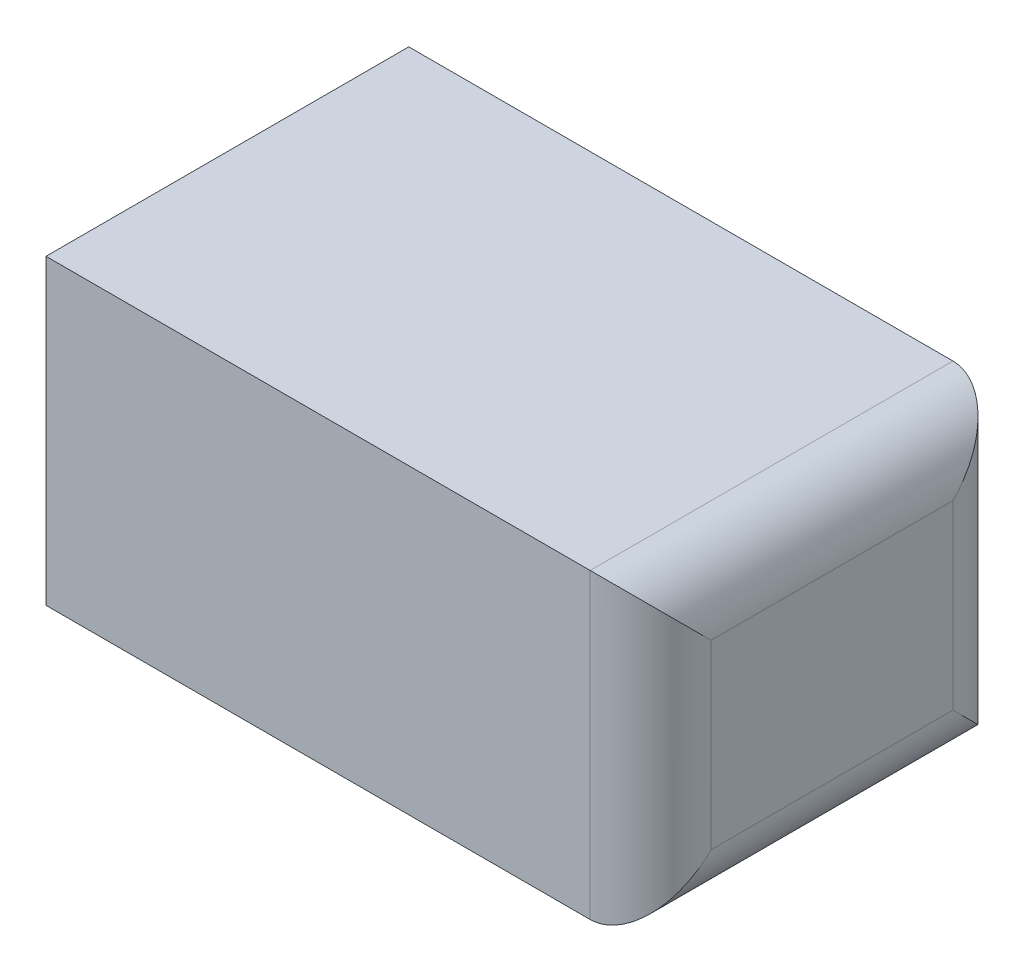
ISO-10303-21;
HEADER;
FILE_DESCRIPTION(('STEP AP214'),'2;1');
FILE_NAME('part.step','',(''),(''),'','','');
FILE_SCHEMA(('AUTOMOTIVE_DESIGN { 1 0 10303 214 1 1 1 1 }'));
ENDSEC;
DATA;
#1=APPLICATION_CONTEXT('core data for automotive mechanical design processes');
#2=APPLICATION_PROTOCOL_DEFINITION('international standard','automotive_design',2000,#1);
#3=PRODUCT_CONTEXT('',#1,'mechanical');
#4=PRODUCT('Part','Part','',(#3));
#5=PRODUCT_RELATED_PRODUCT_CATEGORY('part','',(#4));
#6=PRODUCT_DEFINITION_FORMATION('','',#4);
#7=PRODUCT_DEFINITION_CONTEXT('part definition',#1,'design');
#8=PRODUCT_DEFINITION('design','',#6,#7);
#9=PRODUCT_DEFINITION_SHAPE('','',#8);
#10=(LENGTH_UNIT() NAMED_UNIT(*) SI_UNIT(.MILLI.,.METRE.));
#11=(NAMED_UNIT(*) PLANE_ANGLE_UNIT() SI_UNIT($,.RADIAN.));
#12=(NAMED_UNIT(*) SI_UNIT($,.STERADIAN.) SOLID_ANGLE_UNIT());
#13=UNCERTAINTY_MEASURE_WITH_UNIT(LENGTH_MEASURE(1.E-05),#10,'distance_accuracy_value','');
#14=(GEOMETRIC_REPRESENTATION_CONTEXT(3) GLOBAL_UNCERTAINTY_ASSIGNED_CONTEXT((#13)) GLOBAL_UNIT_ASSIGNED_CONTEXT((#10,
#11,#12)) REPRESENTATION_CONTEXT('',''));
#15=CARTESIAN_POINT('',(0.,0.,0.));
#16=DIRECTION('',(0.,0.,1.));
#17=DIRECTION('',(1.,0.,0.));
#18=AXIS2_PLACEMENT_3D('',#15,#16,#17);
#19=CARTESIAN_POINT('',(94.9928203230218,-96.6499999999944,20.0795136271307));
#20=DIRECTION('',(0.,0.,-1.));
#21=DIRECTION('',(-1.,0.,0.));
#22=AXIS2_PLACEMENT_3D('',#19,#20,#21);
#23=CYLINDRICAL_SURFACE('',#22,0.200000000000013);
#24=CARTESIAN_POINT('',(94.9928203230218,-96.6499999999944,19.8555136271306));
#25=DIRECTION('',(0.,-0.707106781186547,0.707106781186547));
#26=DIRECTION('',(0.,-0.707106781186547,-0.707106781186547));
#27=AXIS2_PLACEMENT_3D('',#24,#25,#26);
#28=ELLIPSE('',#27,0.282842712474637,0.200000000000013);
#29=CARTESIAN_POINT('',(95.1928203230214,-96.6499999999944,19.8555136271306));
#30=VERTEX_POINT('',#29);
#31=CARTESIAN_POINT('',(94.9928203230218,-96.4499999999948,20.0555136271302));
#32=VERTEX_POINT('',#31);
#33=EDGE_CURVE('E108',#30,#32,#28,.T.);
#34=ORIENTED_EDGE('',*,*,#33,.F.);
#35=DIRECTION('',(0.,0.,-1.));
#36=VECTOR('',#35,1.);
#37=CARTESIAN_POINT('',(95.192820323021,-96.6499999999944,19.4555136271296));
#38=LINE('',#37,#36);
#39=CARTESIAN_POINT('',(95.1928203230214,-96.6499999999944,19.0555136271312));
#40=VERTEX_POINT('',#39);
#41=EDGE_CURVE('E82',#40,#30,#38,.F.);
#42=ORIENTED_EDGE('',*,*,#41,.F.);
#43=CARTESIAN_POINT('',(94.9928203230218,-96.6499999999944,19.0555136271312));
#44=DIRECTION('',(0.,-0.707106781186547,-0.707106781186547));
#45=DIRECTION('',(0.,-0.707106781186547,0.707106781186547));
#46=AXIS2_PLACEMENT_3D('',#43,#44,#45);
#47=ELLIPSE('',#46,0.282842712474619,0.2);
#48=CARTESIAN_POINT('',(94.9928203230218,-96.4499999999939,18.8555136271308));
#49=VERTEX_POINT('',#48);
#50=EDGE_CURVE('E20',#49,#40,#47,.T.);
#51=ORIENTED_EDGE('',*,*,#50,.F.);
#52=DIRECTION('',(0.,0.,1.));
#53=VECTOR('',#52,1.);
#54=CARTESIAN_POINT('',(94.9928203230218,-96.4499999999952,19.4555136271296));
#55=LINE('',#54,#53);
#56=EDGE_CURVE('E66',#32,#49,#55,.F.);
#57=ORIENTED_EDGE('',*,*,#56,.F.);
#58=EDGE_LOOP('',(#34,#42,#51,#57));
#59=FACE_BOUND('',#58,.T.);
#60=ADVANCED_FACE('F17',(#59),#23,.T.);
#61=CARTESIAN_POINT('',(95.192820323021,-96.9499999999932,19.4555136271296));
#62=DIRECTION('',(1.,0.,0.));
#63=DIRECTION('',(0.,0.,-1.));
#64=AXIS2_PLACEMENT_3D('',#61,#62,#63);
#65=PLANE('',#64);
#66=DIRECTION('',(0.,-1.,0.));
#67=VECTOR('',#66,1.);
#68=CARTESIAN_POINT('',(95.1928203230218,-96.4299999999902,19.8555136271306));
#69=LINE('',#68,#67);
#70=CARTESIAN_POINT('',(95.1928203230218,-97.249999999992,19.8555136271306));
#71=VERTEX_POINT('',#70);
#72=EDGE_CURVE('E77',#71,#30,#69,.F.);
#73=ORIENTED_EDGE('',*,*,#72,.F.);
#74=DIRECTION('',(0.,0.,1.));
#75=VECTOR('',#74,1.);
#76=CARTESIAN_POINT('',(95.1928203230218,-97.249999999992,18.8315136271311));
#77=LINE('',#76,#75);
#78=CARTESIAN_POINT('',(95.1928203230218,-97.249999999992,19.0555136271312));
#79=VERTEX_POINT('',#78);
#80=EDGE_CURVE('E100',#79,#71,#77,.T.);
#81=ORIENTED_EDGE('',*,*,#80,.F.);
#82=DIRECTION('',(0.,-1.,0.));
#83=VECTOR('',#82,1.);
#84=CARTESIAN_POINT('',(95.1928203230218,-96.4299999999902,19.0555136271312));
#85=LINE('',#84,#83);
#86=EDGE_CURVE('E78',#40,#79,#85,.T.);
#87=ORIENTED_EDGE('',*,*,#86,.F.);
#88=ORIENTED_EDGE('',*,*,#41,.T.);
#89=EDGE_LOOP('',(#73,#81,#87,#88));
#90=FACE_BOUND('',#89,.T.);
#91=ADVANCED_FACE('F139',(#90),#65,.T.);
#92=CARTESIAN_POINT('',(94.9928203230218,-96.4299999999902,19.0555136271312));
#93=DIRECTION('',(0.,-1.,0.));
#94=DIRECTION('',(0.,0.,-1.));
#95=AXIS2_PLACEMENT_3D('',#92,#93,#94);
#96=CYLINDRICAL_SURFACE('',#95,0.199999999999987);
#97=ORIENTED_EDGE('',*,*,#50,.T.);
#98=ORIENTED_EDGE('',*,*,#86,.T.);
#99=CARTESIAN_POINT('',(94.9928203230218,-97.249999999992,19.0555136271312));
#100=DIRECTION('',(0.,-0.707106781186547,0.707106781186547));
#101=DIRECTION('',(0.,0.707106781186547,0.707106781186547));
#102=AXIS2_PLACEMENT_3D('',#99,#100,#101);
#103=ELLIPSE('',#102,0.282842712474619,0.2);
#104=CARTESIAN_POINT('',(94.9928203230218,-97.4499999999925,18.8555136271307));
#105=VERTEX_POINT('',#104);
#106=EDGE_CURVE('E96',#105,#79,#103,.T.);
#107=ORIENTED_EDGE('',*,*,#106,.F.);
#108=DIRECTION('',(0.,1.,0.));
#109=VECTOR('',#108,1.);
#110=CARTESIAN_POINT('',(94.9928203230218,-96.9499999999932,18.8555136271295));
#111=LINE('',#110,#109);
#112=EDGE_CURVE('E90',#105,#49,#111,.T.);
#113=ORIENTED_EDGE('',*,*,#112,.T.);
#114=EDGE_LOOP('',(#97,#98,#107,#113));
#115=FACE_BOUND('',#114,.T.);
#116=ADVANCED_FACE('F94',(#115),#96,.T.);
#117=CARTESIAN_POINT('',(94.0928203230254,-96.4499999999952,19.4555136271296));
#118=DIRECTION('',(0.,1.,0.));
#119=DIRECTION('',(0.,0.,1.));
#120=AXIS2_PLACEMENT_3D('',#117,#118,#119);
#121=PLANE('',#120);
#122=DIRECTION('',(1.,0.,0.));
#123=VECTOR('',#122,1.);
#124=CARTESIAN_POINT('',(94.0928203230254,-96.4499999999952,20.0555136271298));
#125=LINE('',#124,#123);
#126=CARTESIAN_POINT('',(93.192820323029,-96.4499999999952,20.0555136271298));
#127=VERTEX_POINT('',#126);
#128=EDGE_CURVE('E73',#32,#127,#125,.F.);
#129=ORIENTED_EDGE('',*,*,#128,.F.);
#130=ORIENTED_EDGE('',*,*,#56,.T.);
#131=DIRECTION('',(1.,0.,0.));
#132=VECTOR('',#131,1.);
#133=CARTESIAN_POINT('',(94.0928203230254,-96.4499999999952,18.8555136271295));
#134=LINE('',#133,#132);
#135=CARTESIAN_POINT('',(93.192820323029,-96.4499999999952,18.8555136271295));
#136=VERTEX_POINT('',#135);
#137=EDGE_CURVE('E71',#49,#136,#134,.F.);
#138=ORIENTED_EDGE('',*,*,#137,.T.);
#139=DIRECTION('',(0.,0.,-1.));
#140=VECTOR('',#139,1.);
#141=CARTESIAN_POINT('',(93.192820323029,-96.4499999999952,19.4555136271296));
#142=LINE('',#141,#140);
#143=EDGE_CURVE('E110',#136,#127,#142,.F.);
#144=ORIENTED_EDGE('',*,*,#143,.T.);
#145=EDGE_LOOP('',(#129,#130,#138,#144));
#146=FACE_BOUND('',#145,.T.);
#147=ADVANCED_FACE('F68',(#146),#121,.T.);
#148=CARTESIAN_POINT('',(94.9928203230218,-96.4299999999902,19.8555136271306));
#149=DIRECTION('',(0.,-1.,0.));
#150=DIRECTION('',(0.,0.,-1.));
#151=AXIS2_PLACEMENT_3D('',#148,#149,#150);
#152=CYLINDRICAL_SURFACE('',#151,0.200000000000013);
#153=ORIENTED_EDGE('',*,*,#33,.T.);
#154=DIRECTION('',(0.,1.,0.));
#155=VECTOR('',#154,1.);
#156=CARTESIAN_POINT('',(94.9928203230218,-96.9499999999932,20.0555136271298));
#157=LINE('',#156,#155);
#158=CARTESIAN_POINT('',(94.9928203230218,-97.4499999999916,20.0555136271302));
#159=VERTEX_POINT('',#158);
#160=EDGE_CURVE('E117',#159,#32,#157,.T.);
#161=ORIENTED_EDGE('',*,*,#160,.F.);
#162=CARTESIAN_POINT('',(94.9928203230218,-97.249999999992,19.8555136271306));
#163=DIRECTION('',(0.,0.707106781186547,0.707106781186547));
#164=DIRECTION('',(0.,-0.707106781186547,0.707106781186547));
#165=AXIS2_PLACEMENT_3D('',#162,#163,#164);
#166=ELLIPSE('',#165,0.282842712474637,0.200000000000013);
#167=EDGE_CURVE('E98',#71,#159,#166,.F.);
#168=ORIENTED_EDGE('',*,*,#167,.F.);
#169=ORIENTED_EDGE('',*,*,#72,.T.);
#170=EDGE_LOOP('',(#153,#161,#168,#169));
#171=FACE_BOUND('',#170,.T.);
#172=ADVANCED_FACE('F134',(#171),#152,.T.);
#173=CARTESIAN_POINT('',(94.9928203230218,-97.249999999992,18.8315136271311));
#174=DIRECTION('',(0.,0.,1.));
#175=DIRECTION('',(1.,0.,0.));
#176=AXIS2_PLACEMENT_3D('',#173,#174,#175);
#177=CYLINDRICAL_SURFACE('',#176,0.200000000000013);
#178=ORIENTED_EDGE('',*,*,#167,.T.);
#179=DIRECTION('',(0.,0.,1.));
#180=VECTOR('',#179,1.);
#181=CARTESIAN_POINT('',(94.9928203230218,-97.4499999999912,19.4555136271296));
#182=LINE('',#181,#180);
#183=EDGE_CURVE('E144',#159,#105,#182,.F.);
#184=ORIENTED_EDGE('',*,*,#183,.T.);
#185=ORIENTED_EDGE('',*,*,#106,.T.);
#186=ORIENTED_EDGE('',*,*,#80,.T.);
#187=EDGE_LOOP('',(#178,#184,#185,#186));
#188=FACE_BOUND('',#187,.T.);
#189=ADVANCED_FACE('F142',(#188),#177,.T.);
#190=CARTESIAN_POINT('',(94.0928203230254,-96.9499999999932,18.8555136271295));
#191=DIRECTION('',(0.,0.,1.));
#192=DIRECTION('',(1.,0.,0.));
#193=AXIS2_PLACEMENT_3D('',#190,#191,#192);
#194=PLANE('',#193);
#195=DIRECTION('',(0.,1.,0.));
#196=VECTOR('',#195,1.);
#197=CARTESIAN_POINT('',(93.192820323029,-96.9499999999932,18.8555136271295));
#198=LINE('',#197,#196);
#199=CARTESIAN_POINT('',(93.192820323029,-97.4499999999912,18.8555136271295));
#200=VERTEX_POINT('',#199);
#201=EDGE_CURVE('E92',#200,#136,#198,.T.);
#202=ORIENTED_EDGE('',*,*,#201,.T.);
#203=ORIENTED_EDGE('',*,*,#137,.F.);
#204=ORIENTED_EDGE('',*,*,#112,.F.);
#205=DIRECTION('',(1.,0.,0.));
#206=VECTOR('',#205,1.);
#207=CARTESIAN_POINT('',(94.0928203230254,-97.4499999999912,18.8555136271295));
#208=LINE('',#207,#206);
#209=EDGE_CURVE('E127',#105,#200,#208,.F.);
#210=ORIENTED_EDGE('',*,*,#209,.T.);
#211=EDGE_LOOP('',(#202,#203,#204,#210));
#212=FACE_BOUND('',#211,.T.);
#213=ADVANCED_FACE('F88',(#212),#194,.F.);
#214=CARTESIAN_POINT('',(93.192820323029,-96.9499999999932,19.4555136271296));
#215=DIRECTION('',(1.,0.,0.));
#216=DIRECTION('',(0.,0.,-1.));
#217=AXIS2_PLACEMENT_3D('',#214,#215,#216);
#218=PLANE('',#217);
#219=ORIENTED_EDGE('',*,*,#143,.F.);
#220=ORIENTED_EDGE('',*,*,#201,.F.);
#221=DIRECTION('',(0.,0.,1.));
#222=VECTOR('',#221,1.);
#223=CARTESIAN_POINT('',(93.192820323029,-97.4499999999912,19.4555136271296));
#224=LINE('',#223,#222);
#225=CARTESIAN_POINT('',(93.192820323029,-97.4499999999912,20.0555136271298));
#226=VERTEX_POINT('',#225);
#227=EDGE_CURVE('E26',#200,#226,#224,.T.);
#228=ORIENTED_EDGE('',*,*,#227,.T.);
#229=DIRECTION('',(0.,1.,0.));
#230=VECTOR('',#229,1.);
#231=CARTESIAN_POINT('',(93.192820323029,-96.9499999999932,20.0555136271298));
#232=LINE('',#231,#230);
#233=EDGE_CURVE('E34',#127,#226,#232,.F.);
#234=ORIENTED_EDGE('',*,*,#233,.F.);
#235=EDGE_LOOP('',(#219,#220,#228,#234));
#236=FACE_BOUND('',#235,.T.);
#237=ADVANCED_FACE('F153',(#236),#218,.F.);
#238=CARTESIAN_POINT('',(94.0928203230254,-96.9499999999932,20.0555136271298));
#239=DIRECTION('',(0.,0.,1.));
#240=DIRECTION('',(1.,0.,0.));
#241=AXIS2_PLACEMENT_3D('',#238,#239,#240);
#242=PLANE('',#241);
#243=DIRECTION('',(1.,0.,0.));
#244=VECTOR('',#243,1.);
#245=CARTESIAN_POINT('',(94.0928203230254,-97.4499999999912,20.0555136271298));
#246=LINE('',#245,#244);
#247=EDGE_CURVE('E11',#226,#159,#246,.T.);
#248=ORIENTED_EDGE('',*,*,#247,.T.);
#249=ORIENTED_EDGE('',*,*,#160,.T.);
#250=ORIENTED_EDGE('',*,*,#128,.T.);
#251=ORIENTED_EDGE('',*,*,#233,.T.);
#252=EDGE_LOOP('',(#248,#249,#250,#251));
#253=FACE_BOUND('',#252,.T.);
#254=ADVANCED_FACE('F149',(#253),#242,.T.);
#255=CARTESIAN_POINT('',(94.0928203230254,-97.4499999999912,19.4555136271296));
#256=DIRECTION('',(0.,1.,0.));
#257=DIRECTION('',(0.,0.,1.));
#258=AXIS2_PLACEMENT_3D('',#255,#256,#257);
#259=PLANE('',#258);
#260=ORIENTED_EDGE('',*,*,#227,.F.);
#261=ORIENTED_EDGE('',*,*,#209,.F.);
#262=ORIENTED_EDGE('',*,*,#183,.F.);
#263=ORIENTED_EDGE('',*,*,#247,.F.);
#264=EDGE_LOOP('',(#260,#261,#262,#263));
#265=FACE_BOUND('',#264,.T.);
#266=ADVANCED_FACE('F151',(#265),#259,.F.);
#267=CLOSED_SHELL('',(#60,#91,#116,#147,#172,#189,#213,#237,#254,#266));
#268=MANIFOLD_SOLID_BREP('B1',#267);
#269=ADVANCED_BREP_SHAPE_REPRESENTATION('',(#18,#268),#14);
#270=SHAPE_DEFINITION_REPRESENTATION(#9,#269);
ENDSEC;
END-ISO-10303-21;
